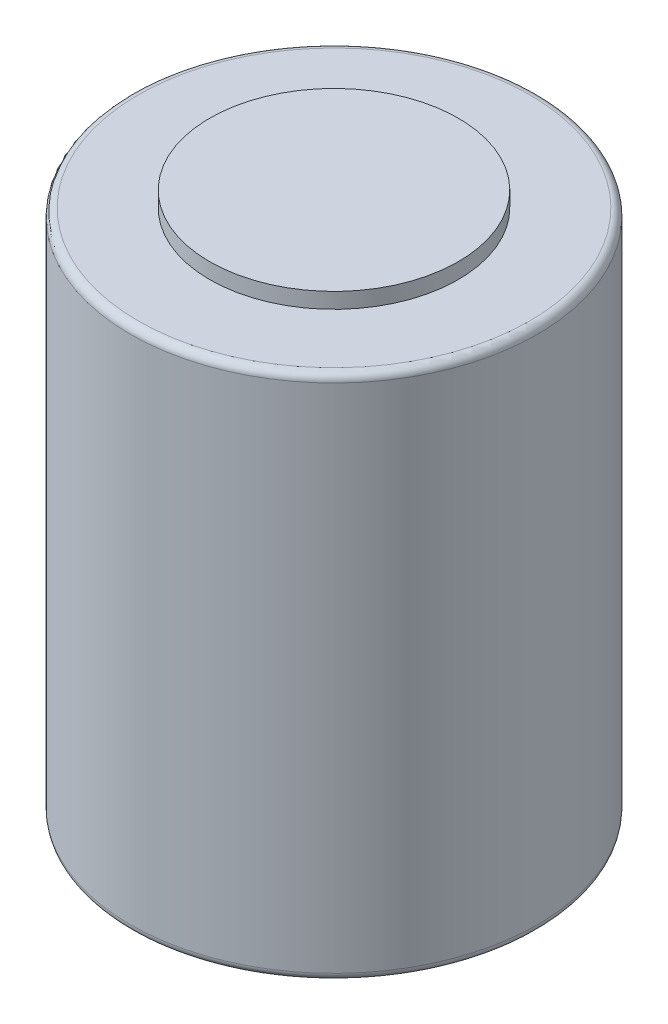
ISO-10303-21;
HEADER;
FILE_DESCRIPTION(('STEP AP214'),'2;1');
FILE_NAME('part.step','',(''),(''),'','','');
FILE_SCHEMA(('AUTOMOTIVE_DESIGN { 1 0 10303 214 1 1 1 1 }'));
ENDSEC;
DATA;
#1=APPLICATION_CONTEXT('core data for automotive mechanical design processes');
#2=APPLICATION_PROTOCOL_DEFINITION('international standard','automotive_design',2000,#1);
#3=PRODUCT_CONTEXT('',#1,'mechanical');
#4=PRODUCT('Part','Part','',(#3));
#5=PRODUCT_RELATED_PRODUCT_CATEGORY('part','',(#4));
#6=PRODUCT_DEFINITION_FORMATION('','',#4);
#7=PRODUCT_DEFINITION_CONTEXT('part definition',#1,'design');
#8=PRODUCT_DEFINITION('design','',#6,#7);
#9=PRODUCT_DEFINITION_SHAPE('','',#8);
#10=(LENGTH_UNIT() NAMED_UNIT(*) SI_UNIT(.MILLI.,.METRE.));
#11=(NAMED_UNIT(*) PLANE_ANGLE_UNIT() SI_UNIT($,.RADIAN.));
#12=(NAMED_UNIT(*) SI_UNIT($,.STERADIAN.) SOLID_ANGLE_UNIT());
#13=UNCERTAINTY_MEASURE_WITH_UNIT(LENGTH_MEASURE(1.E-05),#10,'distance_accuracy_value','');
#14=(GEOMETRIC_REPRESENTATION_CONTEXT(3) GLOBAL_UNCERTAINTY_ASSIGNED_CONTEXT((#13)) GLOBAL_UNIT_ASSIGNED_CONTEXT((#10,
#11,#12)) REPRESENTATION_CONTEXT('',''));
#15=CARTESIAN_POINT('',(0.,0.,0.));
#16=DIRECTION('',(0.,0.,1.));
#17=DIRECTION('',(1.,0.,0.));
#18=AXIS2_PLACEMENT_3D('',#15,#16,#17);
#19=CARTESIAN_POINT('',(0.,35.,0.));
#20=DIRECTION('',(0.,-1.,0.));
#21=DIRECTION('',(0.,0.,-1.));
#22=AXIS2_PLACEMENT_3D('',#19,#20,#21);
#23=CYLINDRICAL_SURFACE('',#22,13.1);
#24=CARTESIAN_POINT('',(0.,33.5,0.));
#25=DIRECTION('',(0.,1.,0.));
#26=DIRECTION('',(0.,0.,1.));
#27=AXIS2_PLACEMENT_3D('',#24,#25,#26);
#28=CIRCLE('',#27,13.1);
#29=CARTESIAN_POINT('',(0.,33.5,13.1));
#30=VERTEX_POINT('',#29);
#31=EDGE_CURVE('E51',#30,#30,#28,.F.);
#32=ORIENTED_EDGE('',*,*,#31,.T.);
#33=EDGE_LOOP('',(#32));
#34=FACE_BOUND('',#33,.T.);
#35=CARTESIAN_POINT('',(0.,0.600000000000003,0.));
#36=DIRECTION('',(0.,-1.,0.));
#37=DIRECTION('',(0.,0.,-1.));
#38=AXIS2_PLACEMENT_3D('',#35,#36,#37);
#39=CIRCLE('',#38,13.1);
#40=CARTESIAN_POINT('',(0.,0.600000000000003,-13.1));
#41=VERTEX_POINT('',#40);
#42=EDGE_CURVE('E56',#41,#41,#39,.F.);
#43=ORIENTED_EDGE('',*,*,#42,.T.);
#44=EDGE_LOOP('',(#43));
#45=FACE_BOUND('',#44,.T.);
#46=ADVANCED_FACE('F43',(#34,#45),#23,.T.);
#47=CARTESIAN_POINT('',(0.,34.,0.));
#48=DIRECTION('',(0.,1.,0.));
#49=DIRECTION('',(0.,0.,1.));
#50=AXIS2_PLACEMENT_3D('',#47,#48,#49);
#51=PLANE('',#50);
#52=CARTESIAN_POINT('',(0.,34.,0.));
#53=DIRECTION('',(0.,1.,0.));
#54=DIRECTION('',(0.,0.,1.));
#55=AXIS2_PLACEMENT_3D('',#52,#53,#54);
#56=CIRCLE('',#55,12.6);
#57=CARTESIAN_POINT('',(0.,34.,12.6));
#58=VERTEX_POINT('',#57);
#59=EDGE_CURVE('E61',#58,#58,#56,.T.);
#60=ORIENTED_EDGE('',*,*,#59,.T.);
#61=EDGE_LOOP('',(#60));
#62=FACE_BOUND('',#61,.T.);
#63=CARTESIAN_POINT('',(0.,34.,0.));
#64=DIRECTION('',(0.,1.,0.));
#65=DIRECTION('',(0.,0.,1.));
#66=AXIS2_PLACEMENT_3D('',#63,#64,#65);
#67=CIRCLE('',#66,8.);
#68=CARTESIAN_POINT('',(0.,34.,8.));
#69=VERTEX_POINT('',#68);
#70=EDGE_CURVE('E67',#69,#69,#67,.T.);
#71=ORIENTED_EDGE('',*,*,#70,.F.);
#72=EDGE_LOOP('',(#71));
#73=FACE_BOUND('',#72,.T.);
#74=ADVANCED_FACE('F102',(#62,#73),#51,.T.);
#75=CARTESIAN_POINT('',(0.,34.,0.));
#76=DIRECTION('',(0.,1.,0.));
#77=DIRECTION('',(0.,0.,1.));
#78=AXIS2_PLACEMENT_3D('',#75,#76,#77);
#79=CYLINDRICAL_SURFACE('',#78,8.);
#80=ORIENTED_EDGE('',*,*,#70,.T.);
#81=EDGE_LOOP('',(#80));
#82=FACE_BOUND('',#81,.T.);
#83=CARTESIAN_POINT('',(0.,35.,0.));
#84=DIRECTION('',(0.,1.,0.));
#85=DIRECTION('',(0.,0.,1.));
#86=AXIS2_PLACEMENT_3D('',#83,#84,#85);
#87=CIRCLE('',#86,8.);
#88=CARTESIAN_POINT('',(0.,35.,8.));
#89=VERTEX_POINT('',#88);
#90=EDGE_CURVE('E68',#89,#89,#87,.T.);
#91=ORIENTED_EDGE('',*,*,#90,.F.);
#92=EDGE_LOOP('',(#91));
#93=FACE_BOUND('',#92,.T.);
#94=ADVANCED_FACE('F97',(#82,#93),#79,.T.);
#95=CARTESIAN_POINT('',(0.,35.,0.));
#96=DIRECTION('',(0.,1.,0.));
#97=DIRECTION('',(0.,0.,1.));
#98=AXIS2_PLACEMENT_3D('',#95,#96,#97);
#99=PLANE('',#98);
#100=ORIENTED_EDGE('',*,*,#90,.T.);
#101=EDGE_LOOP('',(#100));
#102=FACE_BOUND('',#101,.T.);
#103=ADVANCED_FACE('F89',(#102),#99,.T.);
#104=CARTESIAN_POINT('',(0.,0.1,0.));
#105=DIRECTION('',(0.,-1.,0.));
#106=DIRECTION('',(0.,0.,-1.));
#107=AXIS2_PLACEMENT_3D('',#104,#105,#106);
#108=PLANE('',#107);
#109=CARTESIAN_POINT('',(0.,0.1,0.));
#110=DIRECTION('',(0.,-1.,0.));
#111=DIRECTION('',(0.,0.,-1.));
#112=AXIS2_PLACEMENT_3D('',#109,#110,#111);
#113=CIRCLE('',#112,12.6);
#114=CARTESIAN_POINT('',(0.,0.1,-12.6));
#115=VERTEX_POINT('',#114);
#116=EDGE_CURVE('E10',#115,#115,#113,.T.);
#117=ORIENTED_EDGE('',*,*,#116,.T.);
#118=EDGE_LOOP('',(#117));
#119=FACE_BOUND('',#118,.T.);
#120=CARTESIAN_POINT('',(0.,0.1,0.));
#121=DIRECTION('',(0.,-1.,0.));
#122=DIRECTION('',(0.,0.,-1.));
#123=AXIS2_PLACEMENT_3D('',#120,#121,#122);
#124=CIRCLE('',#123,10.25);
#125=CARTESIAN_POINT('',(0.,0.1,-10.25));
#126=VERTEX_POINT('',#125);
#127=EDGE_CURVE('E72',#126,#126,#124,.T.);
#128=ORIENTED_EDGE('',*,*,#127,.F.);
#129=EDGE_LOOP('',(#128));
#130=FACE_BOUND('',#129,.T.);
#131=ADVANCED_FACE('F87',(#119,#130),#108,.T.);
#132=CARTESIAN_POINT('',(0.,0.1,0.));
#133=DIRECTION('',(0.,-1.,0.));
#134=DIRECTION('',(0.,0.,-1.));
#135=AXIS2_PLACEMENT_3D('',#132,#133,#134);
#136=CYLINDRICAL_SURFACE('',#135,10.25);
#137=ORIENTED_EDGE('',*,*,#127,.T.);
#138=EDGE_LOOP('',(#137));
#139=FACE_BOUND('',#138,.T.);
#140=CARTESIAN_POINT('',(0.,0.,0.));
#141=DIRECTION('',(0.,-1.,0.));
#142=DIRECTION('',(0.,0.,-1.));
#143=AXIS2_PLACEMENT_3D('',#140,#141,#142);
#144=CIRCLE('',#143,10.25);
#145=CARTESIAN_POINT('',(0.,0.,-10.25));
#146=VERTEX_POINT('',#145);
#147=EDGE_CURVE('E76',#146,#146,#144,.T.);
#148=ORIENTED_EDGE('',*,*,#147,.F.);
#149=EDGE_LOOP('',(#148));
#150=FACE_BOUND('',#149,.T.);
#151=ADVANCED_FACE('F84',(#139,#150),#136,.T.);
#152=CARTESIAN_POINT('',(0.,0.,0.));
#153=DIRECTION('',(0.,1.,0.));
#154=DIRECTION('',(0.,0.,1.));
#155=AXIS2_PLACEMENT_3D('',#152,#153,#154);
#156=PLANE('',#155);
#157=ORIENTED_EDGE('',*,*,#147,.T.);
#158=EDGE_LOOP('',(#157));
#159=FACE_BOUND('',#158,.T.);
#160=ADVANCED_FACE('F95',(#159),#156,.F.);
#161=CARTESIAN_POINT('',(0.,33.5,0.));
#162=DIRECTION('',(0.,1.,0.));
#163=DIRECTION('',(0.,0.,1.));
#164=AXIS2_PLACEMENT_3D('',#161,#162,#163);
#165=TOROIDAL_SURFACE('',#164,12.6,0.5);
#166=ORIENTED_EDGE('',*,*,#31,.F.);
#167=EDGE_LOOP('',(#166));
#168=FACE_BOUND('',#167,.T.);
#169=ORIENTED_EDGE('',*,*,#59,.F.);
#170=EDGE_LOOP('',(#169));
#171=FACE_BOUND('',#170,.T.);
#172=ADVANCED_FACE('F111',(#168,#171),#165,.T.);
#173=CARTESIAN_POINT('',(0.,0.600000000000003,0.));
#174=DIRECTION('',(0.,-1.,0.));
#175=DIRECTION('',(0.,0.,-1.));
#176=AXIS2_PLACEMENT_3D('',#173,#174,#175);
#177=TOROIDAL_SURFACE('',#176,12.6,0.5);
#178=ORIENTED_EDGE('',*,*,#42,.F.);
#179=EDGE_LOOP('',(#178));
#180=FACE_BOUND('',#179,.T.);
#181=ORIENTED_EDGE('',*,*,#116,.F.);
#182=EDGE_LOOP('',(#181));
#183=FACE_BOUND('',#182,.T.);
#184=ADVANCED_FACE('F45',(#180,#183),#177,.T.);
#185=CLOSED_SHELL('',(#46,#74,#94,#103,#131,#151,#160,#172,#184));
#186=MANIFOLD_SOLID_BREP('B2',#185);
#187=ADVANCED_BREP_SHAPE_REPRESENTATION('',(#18,#186),#14);
#188=SHAPE_DEFINITION_REPRESENTATION(#9,#187);
ENDSEC;
END-ISO-10303-21;
